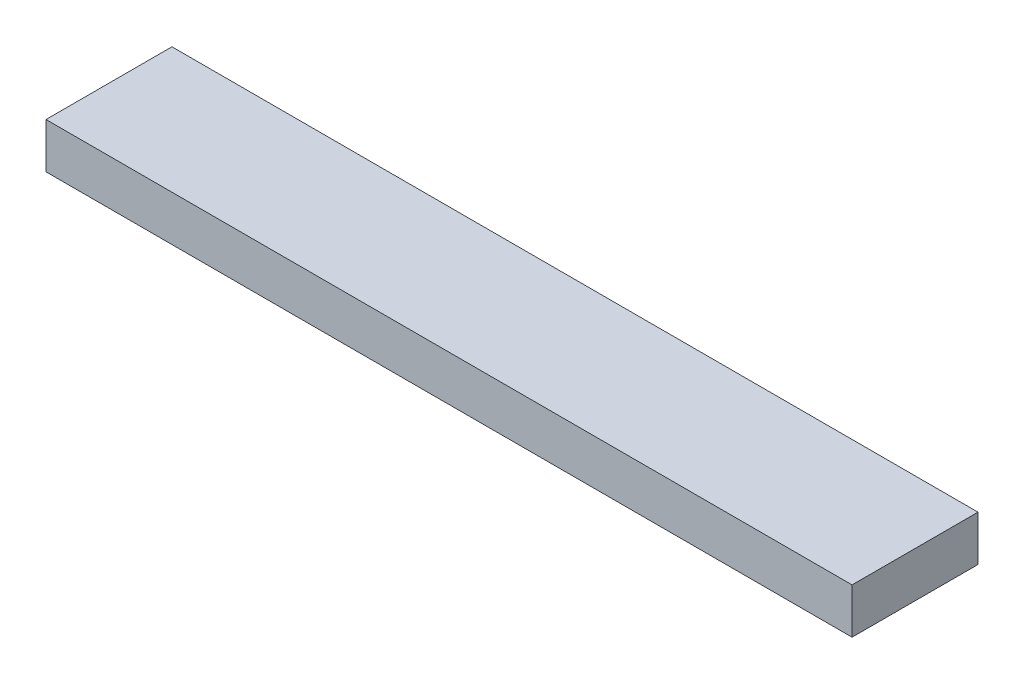
ISO-10303-21;
HEADER;
FILE_DESCRIPTION(('STEP AP214'),'2;1');
FILE_NAME('part.step','',(''),(''),'','','');
FILE_SCHEMA(('AUTOMOTIVE_DESIGN { 1 0 10303 214 1 1 1 1 }'));
ENDSEC;
DATA;
#1=APPLICATION_CONTEXT('core data for automotive mechanical design processes');
#2=APPLICATION_PROTOCOL_DEFINITION('international standard','automotive_design',2000,#1);
#3=PRODUCT_CONTEXT('',#1,'mechanical');
#4=PRODUCT('Part','Part','',(#3));
#5=PRODUCT_RELATED_PRODUCT_CATEGORY('part','',(#4));
#6=PRODUCT_DEFINITION_FORMATION('','',#4);
#7=PRODUCT_DEFINITION_CONTEXT('part definition',#1,'design');
#8=PRODUCT_DEFINITION('design','',#6,#7);
#9=PRODUCT_DEFINITION_SHAPE('','',#8);
#10=(LENGTH_UNIT() NAMED_UNIT(*) SI_UNIT(.MILLI.,.METRE.));
#11=(NAMED_UNIT(*) PLANE_ANGLE_UNIT() SI_UNIT($,.RADIAN.));
#12=(NAMED_UNIT(*) SI_UNIT($,.STERADIAN.) SOLID_ANGLE_UNIT());
#13=UNCERTAINTY_MEASURE_WITH_UNIT(LENGTH_MEASURE(1.E-05),#10,'distance_accuracy_value','');
#14=(GEOMETRIC_REPRESENTATION_CONTEXT(3) GLOBAL_UNCERTAINTY_ASSIGNED_CONTEXT((#13)) GLOBAL_UNIT_ASSIGNED_CONTEXT((#10,
#11,#12)) REPRESENTATION_CONTEXT('',''));
#15=CARTESIAN_POINT('',(0.,0.,0.));
#16=DIRECTION('',(0.,0.,1.));
#17=DIRECTION('',(1.,0.,0.));
#18=AXIS2_PLACEMENT_3D('',#15,#16,#17);
#19=CARTESIAN_POINT('',(40.,4.5,6.25));
#20=DIRECTION('',(-1.,0.,0.));
#21=DIRECTION('',(0.,0.,1.));
#22=AXIS2_PLACEMENT_3D('',#19,#20,#21);
#23=PLANE('',#22);
#24=DIRECTION('',(0.,0.,-1.));
#25=VECTOR('',#24,1.);
#26=CARTESIAN_POINT('',(40.,0.,6.25));
#27=LINE('',#26,#25);
#28=CARTESIAN_POINT('',(40.,0.,6.25));
#29=VERTEX_POINT('',#28);
#30=CARTESIAN_POINT('',(40.,0.,-6.25));
#31=VERTEX_POINT('',#30);
#32=EDGE_CURVE('E103',#29,#31,#27,.T.);
#33=ORIENTED_EDGE('',*,*,#32,.T.);
#34=DIRECTION('',(0.,-1.,0.));
#35=VECTOR('',#34,1.);
#36=CARTESIAN_POINT('',(40.,4.5,-6.25));
#37=LINE('',#36,#35);
#38=CARTESIAN_POINT('',(40.,4.5,-6.25));
#39=VERTEX_POINT('',#38);
#40=EDGE_CURVE('E11',#39,#31,#37,.T.);
#41=ORIENTED_EDGE('',*,*,#40,.F.);
#42=DIRECTION('',(0.,0.,-1.));
#43=VECTOR('',#42,1.);
#44=CARTESIAN_POINT('',(40.,4.5,6.25));
#45=LINE('',#44,#43);
#46=CARTESIAN_POINT('',(40.,4.5,6.25));
#47=VERTEX_POINT('',#46);
#48=EDGE_CURVE('E91',#47,#39,#45,.T.);
#49=ORIENTED_EDGE('',*,*,#48,.F.);
#50=DIRECTION('',(0.,-1.,0.));
#51=VECTOR('',#50,1.);
#52=CARTESIAN_POINT('',(40.,4.5,6.25));
#53=LINE('',#52,#51);
#54=EDGE_CURVE('E99',#47,#29,#53,.T.);
#55=ORIENTED_EDGE('',*,*,#54,.T.);
#56=EDGE_LOOP('',(#33,#41,#49,#55));
#57=FACE_BOUND('',#56,.T.);
#58=ADVANCED_FACE('F40',(#57),#23,.F.);
#59=CARTESIAN_POINT('',(-40.,4.5,-6.25));
#60=DIRECTION('',(0.,0.,1.));
#61=DIRECTION('',(1.,0.,0.));
#62=AXIS2_PLACEMENT_3D('',#59,#60,#61);
#63=PLANE('',#62);
#64=DIRECTION('',(-1.,0.,0.));
#65=VECTOR('',#64,1.);
#66=CARTESIAN_POINT('',(-40.,0.,-6.25));
#67=LINE('',#66,#65);
#68=CARTESIAN_POINT('',(-40.,0.,-6.25));
#69=VERTEX_POINT('',#68);
#70=EDGE_CURVE('E95',#31,#69,#67,.T.);
#71=ORIENTED_EDGE('',*,*,#70,.T.);
#72=DIRECTION('',(0.,-1.,0.));
#73=VECTOR('',#72,1.);
#74=CARTESIAN_POINT('',(-40.,4.5,-6.25));
#75=LINE('',#74,#73);
#76=CARTESIAN_POINT('',(-40.,4.5,-6.25));
#77=VERTEX_POINT('',#76);
#78=EDGE_CURVE('E48',#77,#69,#75,.T.);
#79=ORIENTED_EDGE('',*,*,#78,.F.);
#80=DIRECTION('',(-1.,0.,0.));
#81=VECTOR('',#80,1.);
#82=CARTESIAN_POINT('',(-40.,4.5,-6.25));
#83=LINE('',#82,#81);
#84=EDGE_CURVE('E86',#39,#77,#83,.T.);
#85=ORIENTED_EDGE('',*,*,#84,.F.);
#86=ORIENTED_EDGE('',*,*,#40,.T.);
#87=EDGE_LOOP('',(#71,#79,#85,#86));
#88=FACE_BOUND('',#87,.T.);
#89=ADVANCED_FACE('F94',(#88),#63,.F.);
#90=CARTESIAN_POINT('',(-40.,4.5,6.25));
#91=DIRECTION('',(1.,0.,0.));
#92=DIRECTION('',(0.,0.,-1.));
#93=AXIS2_PLACEMENT_3D('',#90,#91,#92);
#94=PLANE('',#93);
#95=DIRECTION('',(0.,0.,1.));
#96=VECTOR('',#95,1.);
#97=CARTESIAN_POINT('',(-40.,0.,6.25));
#98=LINE('',#97,#96);
#99=CARTESIAN_POINT('',(-40.,0.,6.25));
#100=VERTEX_POINT('',#99);
#101=EDGE_CURVE('E73',#69,#100,#98,.T.);
#102=ORIENTED_EDGE('',*,*,#101,.T.);
#103=DIRECTION('',(0.,-1.,0.));
#104=VECTOR('',#103,1.);
#105=CARTESIAN_POINT('',(-40.,4.5,6.25));
#106=LINE('',#105,#104);
#107=CARTESIAN_POINT('',(-40.,4.5,6.25));
#108=VERTEX_POINT('',#107);
#109=EDGE_CURVE('E96',#108,#100,#106,.T.);
#110=ORIENTED_EDGE('',*,*,#109,.F.);
#111=DIRECTION('',(0.,0.,1.));
#112=VECTOR('',#111,1.);
#113=CARTESIAN_POINT('',(-40.,4.5,6.25));
#114=LINE('',#113,#112);
#115=EDGE_CURVE('E89',#77,#108,#114,.T.);
#116=ORIENTED_EDGE('',*,*,#115,.F.);
#117=ORIENTED_EDGE('',*,*,#78,.T.);
#118=EDGE_LOOP('',(#102,#110,#116,#117));
#119=FACE_BOUND('',#118,.T.);
#120=ADVANCED_FACE('F97',(#119),#94,.F.);
#121=CARTESIAN_POINT('',(-40.,4.5,6.25));
#122=DIRECTION('',(0.,0.,-1.));
#123=DIRECTION('',(-1.,0.,0.));
#124=AXIS2_PLACEMENT_3D('',#121,#122,#123);
#125=PLANE('',#124);
#126=DIRECTION('',(1.,0.,0.));
#127=VECTOR('',#126,1.);
#128=CARTESIAN_POINT('',(-40.,0.,6.25));
#129=LINE('',#128,#127);
#130=EDGE_CURVE('E79',#100,#29,#129,.T.);
#131=ORIENTED_EDGE('',*,*,#130,.T.);
#132=ORIENTED_EDGE('',*,*,#54,.F.);
#133=DIRECTION('',(1.,0.,0.));
#134=VECTOR('',#133,1.);
#135=CARTESIAN_POINT('',(-40.,4.5,6.25));
#136=LINE('',#135,#134);
#137=EDGE_CURVE('E56',#108,#47,#136,.T.);
#138=ORIENTED_EDGE('',*,*,#137,.F.);
#139=ORIENTED_EDGE('',*,*,#109,.T.);
#140=EDGE_LOOP('',(#131,#132,#138,#139));
#141=FACE_BOUND('',#140,.T.);
#142=ADVANCED_FACE('F110',(#141),#125,.F.);
#143=CARTESIAN_POINT('',(0.,4.5,0.));
#144=DIRECTION('',(0.,-1.,0.));
#145=DIRECTION('',(0.,0.,-1.));
#146=AXIS2_PLACEMENT_3D('',#143,#144,#145);
#147=PLANE('',#146);
#148=ORIENTED_EDGE('',*,*,#48,.T.);
#149=ORIENTED_EDGE('',*,*,#84,.T.);
#150=ORIENTED_EDGE('',*,*,#115,.T.);
#151=ORIENTED_EDGE('',*,*,#137,.T.);
#152=EDGE_LOOP('',(#148,#149,#150,#151));
#153=FACE_BOUND('',#152,.T.);
#154=ADVANCED_FACE('F87',(#153),#147,.F.);
#155=CARTESIAN_POINT('',(0.,0.,0.));
#156=DIRECTION('',(0.,-1.,0.));
#157=DIRECTION('',(0.,0.,-1.));
#158=AXIS2_PLACEMENT_3D('',#155,#156,#157);
#159=PLANE('',#158);
#160=ORIENTED_EDGE('',*,*,#32,.F.);
#161=ORIENTED_EDGE('',*,*,#130,.F.);
#162=ORIENTED_EDGE('',*,*,#101,.F.);
#163=ORIENTED_EDGE('',*,*,#70,.F.);
#164=EDGE_LOOP('',(#160,#161,#162,#163));
#165=FACE_BOUND('',#164,.T.);
#166=ADVANCED_FACE('F113',(#165),#159,.T.);
#167=CLOSED_SHELL('',(#58,#89,#120,#142,#154,#166));
#168=MANIFOLD_SOLID_BREP('B2',#167);
#169=ADVANCED_BREP_SHAPE_REPRESENTATION('',(#18,#168),#14);
#170=SHAPE_DEFINITION_REPRESENTATION(#9,#169);
ENDSEC;
END-ISO-10303-21;
